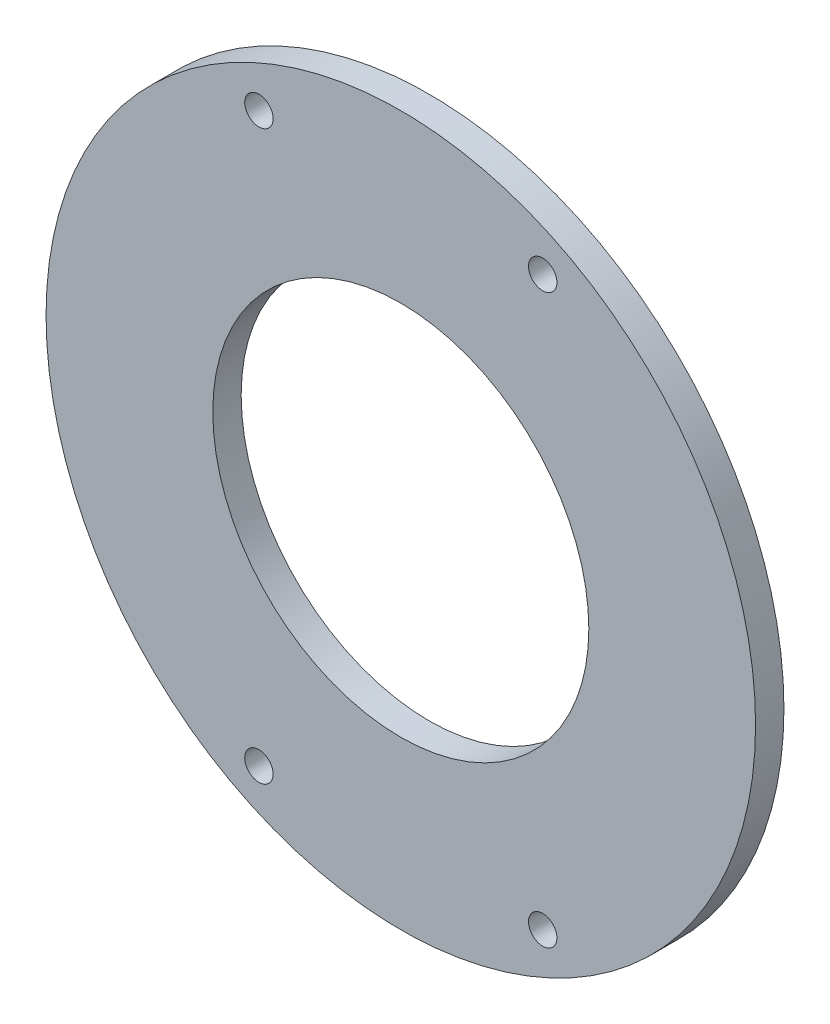
ISO-10303-21;
HEADER;
FILE_DESCRIPTION(('STEP AP214'),'2;1');
FILE_NAME('part.step','',(''),(''),'','','');
FILE_SCHEMA(('AUTOMOTIVE_DESIGN { 1 0 10303 214 1 1 1 1 }'));
ENDSEC;
DATA;
#1=APPLICATION_CONTEXT('core data for automotive mechanical design processes');
#2=APPLICATION_PROTOCOL_DEFINITION('international standard','automotive_design',2000,#1);
#3=PRODUCT_CONTEXT('',#1,'mechanical');
#4=PRODUCT('Part','Part','',(#3));
#5=PRODUCT_RELATED_PRODUCT_CATEGORY('part','',(#4));
#6=PRODUCT_DEFINITION_FORMATION('','',#4);
#7=PRODUCT_DEFINITION_CONTEXT('part definition',#1,'design');
#8=PRODUCT_DEFINITION('design','',#6,#7);
#9=PRODUCT_DEFINITION_SHAPE('','',#8);
#10=(LENGTH_UNIT() NAMED_UNIT(*) SI_UNIT(.MILLI.,.METRE.));
#11=(NAMED_UNIT(*) PLANE_ANGLE_UNIT() SI_UNIT($,.RADIAN.));
#12=(NAMED_UNIT(*) SI_UNIT($,.STERADIAN.) SOLID_ANGLE_UNIT());
#13=UNCERTAINTY_MEASURE_WITH_UNIT(LENGTH_MEASURE(1.E-05),#10,'distance_accuracy_value','');
#14=(GEOMETRIC_REPRESENTATION_CONTEXT(3) GLOBAL_UNCERTAINTY_ASSIGNED_CONTEXT((#13)) GLOBAL_UNIT_ASSIGNED_CONTEXT((#10,
#11,#12)) REPRESENTATION_CONTEXT('',''));
#15=CARTESIAN_POINT('',(0.,0.,0.));
#16=DIRECTION('',(0.,0.,1.));
#17=DIRECTION('',(1.,0.,0.));
#18=AXIS2_PLACEMENT_3D('',#15,#16,#17);
#19=CARTESIAN_POINT('',(0.,-21.8542857142857,4.));
#20=DIRECTION('',(0.,0.,1.));
#21=DIRECTION('',(1.,0.,0.));
#22=AXIS2_PLACEMENT_3D('',#19,#20,#21);
#23=PLANE('',#22);
#24=CARTESIAN_POINT('',(-19.9999999999999,-61.8542857142858,4.));
#25=DIRECTION('',(0.,0.,1.));
#26=DIRECTION('',(-1.,0.,0.));
#27=AXIS2_PLACEMENT_3D('',#24,#25,#26);
#28=CIRCLE('',#27,1.99999999999998);
#29=CARTESIAN_POINT('',(-21.9999999999999,-61.8542857142858,4.));
#30=VERTEX_POINT('',#29);
#31=EDGE_CURVE('E72',#30,#30,#28,.T.);
#32=ORIENTED_EDGE('',*,*,#31,.F.);
#33=EDGE_LOOP('',(#32));
#34=FACE_BOUND('',#33,.T.);
#35=CARTESIAN_POINT('',(20.,18.1457142857143,4.));
#36=DIRECTION('',(0.,0.,1.));
#37=DIRECTION('',(1.,0.,0.));
#38=AXIS2_PLACEMENT_3D('',#35,#36,#37);
#39=CIRCLE('',#38,2.);
#40=CARTESIAN_POINT('',(22.,18.1457142857143,4.));
#41=VERTEX_POINT('',#40);
#42=EDGE_CURVE('E56',#41,#41,#39,.T.);
#43=ORIENTED_EDGE('',*,*,#42,.F.);
#44=EDGE_LOOP('',(#43));
#45=FACE_BOUND('',#44,.T.);
#46=CARTESIAN_POINT('',(0.,-21.8542857142857,4.));
#47=DIRECTION('',(0.,0.,1.));
#48=DIRECTION('',(1.,0.,0.));
#49=AXIS2_PLACEMENT_3D('',#46,#47,#48);
#50=CIRCLE('',#49,50.);
#51=CARTESIAN_POINT('',(50.,-21.8542857142857,4.));
#52=VERTEX_POINT('',#51);
#53=EDGE_CURVE('E10',#52,#52,#50,.T.);
#54=ORIENTED_EDGE('',*,*,#53,.T.);
#55=EDGE_LOOP('',(#54));
#56=FACE_BOUND('',#55,.T.);
#57=CARTESIAN_POINT('',(-19.9999999999999,18.1457142857144,4.));
#58=DIRECTION('',(0.,0.,1.));
#59=DIRECTION('',(1.,0.,0.));
#60=AXIS2_PLACEMENT_3D('',#57,#58,#59);
#61=CIRCLE('',#60,1.99999999999998);
#62=CARTESIAN_POINT('',(-17.9999999999999,18.1457142857144,4.));
#63=VERTEX_POINT('',#62);
#64=EDGE_CURVE('E50',#63,#63,#61,.T.);
#65=ORIENTED_EDGE('',*,*,#64,.F.);
#66=EDGE_LOOP('',(#65));
#67=FACE_BOUND('',#66,.T.);
#68=CARTESIAN_POINT('',(20.,-61.8542857142857,4.));
#69=DIRECTION('',(0.,0.,1.));
#70=DIRECTION('',(-1.,0.,0.));
#71=AXIS2_PLACEMENT_3D('',#68,#69,#70);
#72=CIRCLE('',#71,2.);
#73=CARTESIAN_POINT('',(18.,-61.8542857142857,4.));
#74=VERTEX_POINT('',#73);
#75=EDGE_CURVE('E64',#74,#74,#72,.T.);
#76=ORIENTED_EDGE('',*,*,#75,.F.);
#77=EDGE_LOOP('',(#76));
#78=FACE_BOUND('',#77,.T.);
#79=CARTESIAN_POINT('',(0.,-21.8542857142857,4.));
#80=DIRECTION('',(0.,0.,1.));
#81=DIRECTION('',(1.,0.,0.));
#82=AXIS2_PLACEMENT_3D('',#79,#80,#81);
#83=CIRCLE('',#82,26.5);
#84=CARTESIAN_POINT('',(26.5,-21.8542857142857,4.));
#85=VERTEX_POINT('',#84);
#86=EDGE_CURVE('E80',#85,#85,#83,.T.);
#87=ORIENTED_EDGE('',*,*,#86,.F.);
#88=EDGE_LOOP('',(#87));
#89=FACE_BOUND('',#88,.T.);
#90=ADVANCED_FACE('F37',(#34,#45,#56,#67,#78,#89),#23,.T.);
#91=CARTESIAN_POINT('',(0.,-21.8542857142857,0.));
#92=DIRECTION('',(0.,0.,1.));
#93=DIRECTION('',(1.,0.,0.));
#94=AXIS2_PLACEMENT_3D('',#91,#92,#93);
#95=PLANE('',#94);
#96=CARTESIAN_POINT('',(0.,-21.8542857142857,0.));
#97=DIRECTION('',(0.,0.,1.));
#98=DIRECTION('',(1.,0.,0.));
#99=AXIS2_PLACEMENT_3D('',#96,#97,#98);
#100=CIRCLE('',#99,50.);
#101=CARTESIAN_POINT('',(50.,-21.8542857142857,0.));
#102=VERTEX_POINT('',#101);
#103=EDGE_CURVE('E41',#102,#102,#100,.T.);
#104=ORIENTED_EDGE('',*,*,#103,.F.);
#105=EDGE_LOOP('',(#104));
#106=FACE_BOUND('',#105,.T.);
#107=CARTESIAN_POINT('',(-19.9999999999999,18.1457142857144,0.));
#108=DIRECTION('',(0.,0.,1.));
#109=DIRECTION('',(1.,0.,0.));
#110=AXIS2_PLACEMENT_3D('',#107,#108,#109);
#111=CIRCLE('',#110,1.99999999999998);
#112=CARTESIAN_POINT('',(-17.9999999999999,18.1457142857144,0.));
#113=VERTEX_POINT('',#112);
#114=EDGE_CURVE('E52',#113,#113,#111,.T.);
#115=ORIENTED_EDGE('',*,*,#114,.T.);
#116=EDGE_LOOP('',(#115));
#117=FACE_BOUND('',#116,.T.);
#118=CARTESIAN_POINT('',(20.,18.1457142857143,0.));
#119=DIRECTION('',(0.,0.,1.));
#120=DIRECTION('',(1.,0.,0.));
#121=AXIS2_PLACEMENT_3D('',#118,#119,#120);
#122=CIRCLE('',#121,2.);
#123=CARTESIAN_POINT('',(22.,18.1457142857143,0.));
#124=VERTEX_POINT('',#123);
#125=EDGE_CURVE('E60',#124,#124,#122,.T.);
#126=ORIENTED_EDGE('',*,*,#125,.T.);
#127=EDGE_LOOP('',(#126));
#128=FACE_BOUND('',#127,.T.);
#129=CARTESIAN_POINT('',(20.,-61.8542857142857,0.));
#130=DIRECTION('',(0.,0.,1.));
#131=DIRECTION('',(-1.,0.,0.));
#132=AXIS2_PLACEMENT_3D('',#129,#130,#131);
#133=CIRCLE('',#132,2.);
#134=CARTESIAN_POINT('',(18.,-61.8542857142857,0.));
#135=VERTEX_POINT('',#134);
#136=EDGE_CURVE('E68',#135,#135,#133,.T.);
#137=ORIENTED_EDGE('',*,*,#136,.T.);
#138=EDGE_LOOP('',(#137));
#139=FACE_BOUND('',#138,.T.);
#140=CARTESIAN_POINT('',(-19.9999999999999,-61.8542857142858,0.));
#141=DIRECTION('',(0.,0.,1.));
#142=DIRECTION('',(-1.,0.,0.));
#143=AXIS2_PLACEMENT_3D('',#140,#141,#142);
#144=CIRCLE('',#143,1.99999999999998);
#145=CARTESIAN_POINT('',(-21.9999999999999,-61.8542857142858,0.));
#146=VERTEX_POINT('',#145);
#147=EDGE_CURVE('E76',#146,#146,#144,.T.);
#148=ORIENTED_EDGE('',*,*,#147,.T.);
#149=EDGE_LOOP('',(#148));
#150=FACE_BOUND('',#149,.T.);
#151=CARTESIAN_POINT('',(0.,-21.8542857142857,0.));
#152=DIRECTION('',(0.,0.,1.));
#153=DIRECTION('',(1.,0.,0.));
#154=AXIS2_PLACEMENT_3D('',#151,#152,#153);
#155=CIRCLE('',#154,26.5);
#156=CARTESIAN_POINT('',(26.5,-21.8542857142857,0.));
#157=VERTEX_POINT('',#156);
#158=EDGE_CURVE('E84',#157,#157,#155,.T.);
#159=ORIENTED_EDGE('',*,*,#158,.T.);
#160=EDGE_LOOP('',(#159));
#161=FACE_BOUND('',#160,.T.);
#162=ADVANCED_FACE('F96',(#106,#117,#128,#139,#150,#161),#95,.F.);
#163=CARTESIAN_POINT('',(0.,-21.8542857142857,4.));
#164=DIRECTION('',(0.,0.,-1.));
#165=DIRECTION('',(-1.,0.,0.));
#166=AXIS2_PLACEMENT_3D('',#163,#164,#165);
#167=CYLINDRICAL_SURFACE('',#166,50.);
#168=ORIENTED_EDGE('',*,*,#53,.F.);
#169=EDGE_LOOP('',(#168));
#170=FACE_BOUND('',#169,.T.);
#171=ORIENTED_EDGE('',*,*,#103,.T.);
#172=EDGE_LOOP('',(#171));
#173=FACE_BOUND('',#172,.T.);
#174=ADVANCED_FACE('F39',(#170,#173),#167,.T.);
#175=CARTESIAN_POINT('',(-19.9999999999999,18.1457142857144,4.));
#176=DIRECTION('',(0.,0.,-1.));
#177=DIRECTION('',(-1.,0.,0.));
#178=AXIS2_PLACEMENT_3D('',#175,#176,#177);
#179=CYLINDRICAL_SURFACE('',#178,1.99999999999998);
#180=ORIENTED_EDGE('',*,*,#64,.T.);
#181=EDGE_LOOP('',(#180));
#182=FACE_BOUND('',#181,.T.);
#183=ORIENTED_EDGE('',*,*,#114,.F.);
#184=EDGE_LOOP('',(#183));
#185=FACE_BOUND('',#184,.T.);
#186=ADVANCED_FACE('F106',(#182,#185),#179,.F.);
#187=CARTESIAN_POINT('',(20.,18.1457142857143,4.));
#188=DIRECTION('',(0.,0.,-1.));
#189=DIRECTION('',(-1.,0.,0.));
#190=AXIS2_PLACEMENT_3D('',#187,#188,#189);
#191=CYLINDRICAL_SURFACE('',#190,2.);
#192=ORIENTED_EDGE('',*,*,#42,.T.);
#193=EDGE_LOOP('',(#192));
#194=FACE_BOUND('',#193,.T.);
#195=ORIENTED_EDGE('',*,*,#125,.F.);
#196=EDGE_LOOP('',(#195));
#197=FACE_BOUND('',#196,.T.);
#198=ADVANCED_FACE('F109',(#194,#197),#191,.F.);
#199=CARTESIAN_POINT('',(20.,-61.8542857142857,4.));
#200=DIRECTION('',(0.,0.,-1.));
#201=DIRECTION('',(-1.,0.,0.));
#202=AXIS2_PLACEMENT_3D('',#199,#200,#201);
#203=CYLINDRICAL_SURFACE('',#202,2.);
#204=ORIENTED_EDGE('',*,*,#75,.T.);
#205=EDGE_LOOP('',(#204));
#206=FACE_BOUND('',#205,.T.);
#207=ORIENTED_EDGE('',*,*,#136,.F.);
#208=EDGE_LOOP('',(#207));
#209=FACE_BOUND('',#208,.T.);
#210=ADVANCED_FACE('F113',(#206,#209),#203,.F.);
#211=CARTESIAN_POINT('',(-19.9999999999999,-61.8542857142858,4.));
#212=DIRECTION('',(0.,0.,-1.));
#213=DIRECTION('',(-1.,0.,0.));
#214=AXIS2_PLACEMENT_3D('',#211,#212,#213);
#215=CYLINDRICAL_SURFACE('',#214,1.99999999999998);
#216=ORIENTED_EDGE('',*,*,#31,.T.);
#217=EDGE_LOOP('',(#216));
#218=FACE_BOUND('',#217,.T.);
#219=ORIENTED_EDGE('',*,*,#147,.F.);
#220=EDGE_LOOP('',(#219));
#221=FACE_BOUND('',#220,.T.);
#222=ADVANCED_FACE('F117',(#218,#221),#215,.F.);
#223=CARTESIAN_POINT('',(0.,-21.8542857142857,4.));
#224=DIRECTION('',(0.,0.,-1.));
#225=DIRECTION('',(-1.,0.,0.));
#226=AXIS2_PLACEMENT_3D('',#223,#224,#225);
#227=CYLINDRICAL_SURFACE('',#226,26.5);
#228=ORIENTED_EDGE('',*,*,#86,.T.);
#229=EDGE_LOOP('',(#228));
#230=FACE_BOUND('',#229,.T.);
#231=ORIENTED_EDGE('',*,*,#158,.F.);
#232=EDGE_LOOP('',(#231));
#233=FACE_BOUND('',#232,.T.);
#234=ADVANCED_FACE('F92',(#230,#233),#227,.F.);
#235=CLOSED_SHELL('',(#90,#162,#174,#186,#198,#210,#222,#234));
#236=MANIFOLD_SOLID_BREP('B2',#235);
#237=ADVANCED_BREP_SHAPE_REPRESENTATION('',(#18,#236),#14);
#238=SHAPE_DEFINITION_REPRESENTATION(#9,#237);
ENDSEC;
END-ISO-10303-21;
